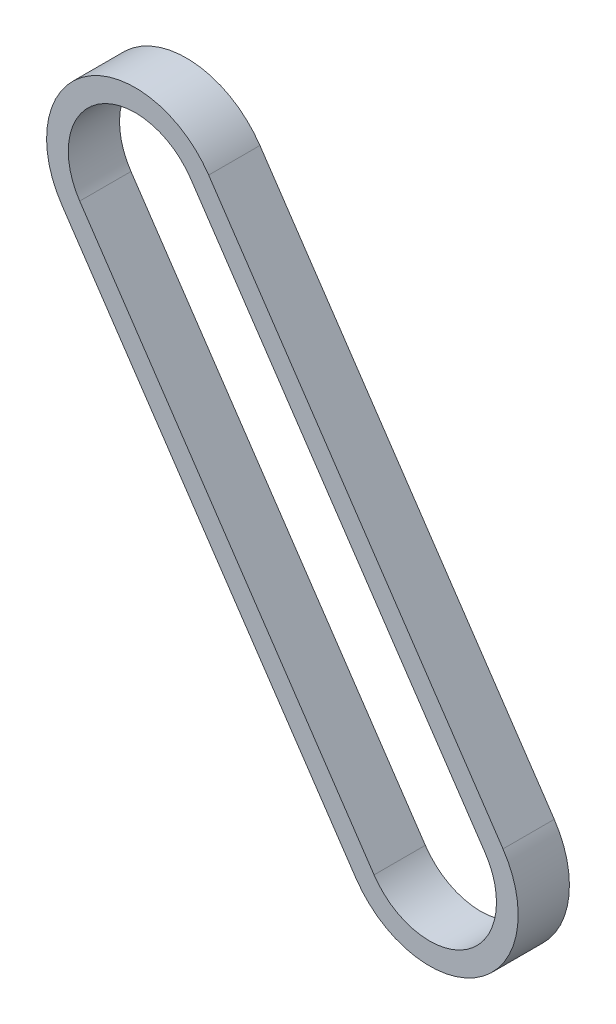
ISO-10303-21;
HEADER;
FILE_DESCRIPTION(('STEP AP214'),'2;1');
FILE_NAME('part.step','',(''),(''),'','','');
FILE_SCHEMA(('AUTOMOTIVE_DESIGN { 1 0 10303 214 1 1 1 1 }'));
ENDSEC;
DATA;
#1=APPLICATION_CONTEXT('core data for automotive mechanical design processes');
#2=APPLICATION_PROTOCOL_DEFINITION('international standard','automotive_design',2000,#1);
#3=PRODUCT_CONTEXT('',#1,'mechanical');
#4=PRODUCT('Part','Part','',(#3));
#5=PRODUCT_RELATED_PRODUCT_CATEGORY('part','',(#4));
#6=PRODUCT_DEFINITION_FORMATION('','',#4);
#7=PRODUCT_DEFINITION_CONTEXT('part definition',#1,'design');
#8=PRODUCT_DEFINITION('design','',#6,#7);
#9=PRODUCT_DEFINITION_SHAPE('','',#8);
#10=(LENGTH_UNIT() NAMED_UNIT(*) SI_UNIT(.MILLI.,.METRE.));
#11=(NAMED_UNIT(*) PLANE_ANGLE_UNIT() SI_UNIT($,.RADIAN.));
#12=(NAMED_UNIT(*) SI_UNIT($,.STERADIAN.) SOLID_ANGLE_UNIT());
#13=UNCERTAINTY_MEASURE_WITH_UNIT(LENGTH_MEASURE(1.E-05),#10,'distance_accuracy_value','');
#14=(GEOMETRIC_REPRESENTATION_CONTEXT(3) GLOBAL_UNCERTAINTY_ASSIGNED_CONTEXT((#13)) GLOBAL_UNIT_ASSIGNED_CONTEXT((#10,
#11,#12)) REPRESENTATION_CONTEXT('',''));
#15=CARTESIAN_POINT('',(0.,0.,0.));
#16=DIRECTION('',(0.,0.,1.));
#17=DIRECTION('',(1.,0.,0.));
#18=AXIS2_PLACEMENT_3D('',#15,#16,#17);
#19=CARTESIAN_POINT('',(0.,0.,4.5));
#20=DIRECTION('',(0.,0.,-1.));
#21=DIRECTION('',(-1.,0.,0.));
#22=AXIS2_PLACEMENT_3D('',#19,#20,#21);
#23=PLANE('',#22);
#24=CARTESIAN_POINT('',(0.,0.,4.5));
#25=DIRECTION('',(0.,0.,-1.));
#26=DIRECTION('',(-1.,0.,0.));
#27=AXIS2_PLACEMENT_3D('',#24,#25,#26);
#28=CIRCLE('',#27,15.5630935922472);
#29=CARTESIAN_POINT('',(-12.9023893331636,-8.70277149283569,4.5));
#30=VERTEX_POINT('',#29);
#31=CARTESIAN_POINT('',(12.9023893331636,8.70277149283567,4.5));
#32=VERTEX_POINT('',#31);
#33=EDGE_CURVE('E166',#30,#32,#28,.F.);
#34=ORIENTED_EDGE('',*,*,#33,.T.);
#35=DIRECTION('',(-0.559192903470746,0.829037572555042,0.));
#36=VECTOR('',#35,1.);
#37=CARTESIAN_POINT('',(12.9023893331636,8.70277149283569,4.5));
#38=LINE('',#37,#36);
#39=CARTESIAN_POINT('',(-38.7874445160736,85.3361016266235,4.5));
#40=VERTEX_POINT('',#39);
#41=EDGE_CURVE('E169',#32,#40,#38,.T.);
#42=ORIENTED_EDGE('',*,*,#41,.T.);
#43=CARTESIAN_POINT('',(-51.6898338492372,76.6333301337878,4.5));
#44=DIRECTION('',(0.,0.,-1.));
#45=DIRECTION('',(-1.,0.,0.));
#46=AXIS2_PLACEMENT_3D('',#43,#44,#45);
#47=CIRCLE('',#46,15.5630935922472);
#48=CARTESIAN_POINT('',(-64.5922231824008,67.9305586409521,4.5));
#49=VERTEX_POINT('',#48);
#50=EDGE_CURVE('E172',#40,#49,#47,.F.);
#51=ORIENTED_EDGE('',*,*,#50,.T.);
#52=DIRECTION('',(0.559192903470746,-0.829037572555042,0.));
#53=VECTOR('',#52,1.);
#54=CARTESIAN_POINT('',(-12.9023893331636,-8.70277149283569,4.5));
#55=LINE('',#54,#53);
#56=EDGE_CURVE('E174',#49,#30,#55,.T.);
#57=ORIENTED_EDGE('',*,*,#56,.T.);
#58=EDGE_LOOP('',(#34,#42,#51,#57));
#59=FACE_BOUND('',#58,.T.);
#60=CARTESIAN_POINT('',(0.,0.,4.5));
#61=DIRECTION('',(0.,0.,-1.));
#62=DIRECTION('',(-1.,0.,0.));
#63=AXIS2_PLACEMENT_3D('',#60,#61,#62);
#64=CIRCLE('',#63,11.7530935922472);
#65=CARTESIAN_POINT('',(-9.74375618172885,-6.57224653061215,4.5));
#66=VERTEX_POINT('',#65);
#67=CARTESIAN_POINT('',(9.74375618172887,6.57224653061213,4.5));
#68=VERTEX_POINT('',#67);
#69=EDGE_CURVE('E130',#66,#68,#64,.F.);
#70=ORIENTED_EDGE('',*,*,#69,.F.);
#71=DIRECTION('',(0.559192903470746,-0.829037572555042,0.));
#72=VECTOR('',#71,1.);
#73=CARTESIAN_POINT('',(-9.74375618172885,-6.57224653061214,4.5));
#74=LINE('',#73,#72);
#75=CARTESIAN_POINT('',(-61.433590030966,70.0610836031757,4.5));
#76=VERTEX_POINT('',#75);
#77=EDGE_CURVE('E152',#76,#66,#74,.T.);
#78=ORIENTED_EDGE('',*,*,#77,.F.);
#79=CARTESIAN_POINT('',(-51.6898338492372,76.6333301337878,4.5));
#80=DIRECTION('',(0.,0.,-1.));
#81=DIRECTION('',(-1.,0.,0.));
#82=AXIS2_PLACEMENT_3D('',#79,#80,#81);
#83=CIRCLE('',#82,11.7530935922472);
#84=CARTESIAN_POINT('',(-41.9460776675083,83.2055766644,4.5));
#85=VERTEX_POINT('',#84);
#86=EDGE_CURVE('E150',#85,#76,#83,.F.);
#87=ORIENTED_EDGE('',*,*,#86,.F.);
#88=DIRECTION('',(-0.559192903470746,0.829037572555042,0.));
#89=VECTOR('',#88,1.);
#90=CARTESIAN_POINT('',(9.74375618172886,6.57224653061215,4.5));
#91=LINE('',#90,#89);
#92=EDGE_CURVE('E138',#68,#85,#91,.T.);
#93=ORIENTED_EDGE('',*,*,#92,.F.);
#94=EDGE_LOOP('',(#70,#78,#87,#93));
#95=FACE_BOUND('',#94,.T.);
#96=ADVANCED_FACE('F65',(#59,#95),#23,.F.);
#97=CARTESIAN_POINT('',(0.,0.,-4.5));
#98=DIRECTION('',(0.,0.,-1.));
#99=DIRECTION('',(-1.,0.,0.));
#100=AXIS2_PLACEMENT_3D('',#97,#98,#99);
#101=PLANE('',#100);
#102=CARTESIAN_POINT('',(0.,0.,-4.5));
#103=DIRECTION('',(0.,0.,-1.));
#104=DIRECTION('',(-1.,0.,0.));
#105=AXIS2_PLACEMENT_3D('',#102,#103,#104);
#106=CIRCLE('',#105,15.5630935922472);
#107=CARTESIAN_POINT('',(-12.9023893331636,-8.70277149283569,-4.5));
#108=VERTEX_POINT('',#107);
#109=CARTESIAN_POINT('',(12.9023893331636,8.70277149283567,-4.5));
#110=VERTEX_POINT('',#109);
#111=EDGE_CURVE('E146',#108,#110,#106,.F.);
#112=ORIENTED_EDGE('',*,*,#111,.F.);
#113=DIRECTION('',(0.559192903470746,-0.829037572555042,0.));
#114=VECTOR('',#113,1.);
#115=CARTESIAN_POINT('',(-12.9023893331636,-8.70277149283569,-4.5));
#116=LINE('',#115,#114);
#117=CARTESIAN_POINT('',(-64.5922231824008,67.9305586409521,-4.5));
#118=VERTEX_POINT('',#117);
#119=EDGE_CURVE('E170',#118,#108,#116,.T.);
#120=ORIENTED_EDGE('',*,*,#119,.F.);
#121=CARTESIAN_POINT('',(-51.6898338492372,76.6333301337878,-4.5));
#122=DIRECTION('',(0.,0.,-1.));
#123=DIRECTION('',(-1.,0.,0.));
#124=AXIS2_PLACEMENT_3D('',#121,#122,#123);
#125=CIRCLE('',#124,15.5630935922472);
#126=CARTESIAN_POINT('',(-38.7874445160736,85.3361016266235,-4.5));
#127=VERTEX_POINT('',#126);
#128=EDGE_CURVE('E181',#127,#118,#125,.F.);
#129=ORIENTED_EDGE('',*,*,#128,.F.);
#130=DIRECTION('',(-0.559192903470746,0.829037572555042,0.));
#131=VECTOR('',#130,1.);
#132=CARTESIAN_POINT('',(12.9023893331636,8.70277149283569,-4.5));
#133=LINE('',#132,#131);
#134=EDGE_CURVE('E179',#110,#127,#133,.T.);
#135=ORIENTED_EDGE('',*,*,#134,.F.);
#136=EDGE_LOOP('',(#112,#120,#129,#135));
#137=FACE_BOUND('',#136,.T.);
#138=DIRECTION('',(0.559192903470746,-0.829037572555042,0.));
#139=VECTOR('',#138,1.);
#140=CARTESIAN_POINT('',(-9.74375618172885,-6.57224653061214,-4.5));
#141=LINE('',#140,#139);
#142=CARTESIAN_POINT('',(-61.4335900309661,70.0610836031757,-4.5));
#143=VERTEX_POINT('',#142);
#144=CARTESIAN_POINT('',(-9.74375618172885,-6.57224653061215,-4.5));
#145=VERTEX_POINT('',#144);
#146=EDGE_CURVE('E139',#143,#145,#141,.T.);
#147=ORIENTED_EDGE('',*,*,#146,.T.);
#148=CARTESIAN_POINT('',(0.,0.,-4.5));
#149=DIRECTION('',(0.,0.,-1.));
#150=DIRECTION('',(-1.,0.,0.));
#151=AXIS2_PLACEMENT_3D('',#148,#149,#150);
#152=CIRCLE('',#151,11.7530935922472);
#153=CARTESIAN_POINT('',(9.74375618172887,6.57224653061213,-4.5));
#154=VERTEX_POINT('',#153);
#155=EDGE_CURVE('E88',#145,#154,#152,.F.);
#156=ORIENTED_EDGE('',*,*,#155,.T.);
#157=DIRECTION('',(-0.559192903470746,0.829037572555042,0.));
#158=VECTOR('',#157,1.);
#159=CARTESIAN_POINT('',(9.74375618172886,6.57224653061215,-4.5));
#160=LINE('',#159,#158);
#161=CARTESIAN_POINT('',(-41.9460776675083,83.2055766644,-4.5));
#162=VERTEX_POINT('',#161);
#163=EDGE_CURVE('E145',#154,#162,#160,.T.);
#164=ORIENTED_EDGE('',*,*,#163,.T.);
#165=CARTESIAN_POINT('',(-51.6898338492372,76.6333301337878,-4.5));
#166=DIRECTION('',(0.,0.,-1.));
#167=DIRECTION('',(-1.,0.,0.));
#168=AXIS2_PLACEMENT_3D('',#165,#166,#167);
#169=CIRCLE('',#168,11.7530935922472);
#170=EDGE_CURVE('E158',#162,#143,#169,.F.);
#171=ORIENTED_EDGE('',*,*,#170,.T.);
#172=EDGE_LOOP('',(#147,#156,#164,#171));
#173=FACE_BOUND('',#172,.T.);
#174=ADVANCED_FACE('F199',(#137,#173),#101,.T.);
#175=CARTESIAN_POINT('',(0.,0.,4.5));
#176=DIRECTION('',(0.,0.,-1.));
#177=DIRECTION('',(-1.,0.,0.));
#178=AXIS2_PLACEMENT_3D('',#175,#176,#177);
#179=CYLINDRICAL_SURFACE('',#178,15.5630935922472);
#180=ORIENTED_EDGE('',*,*,#111,.T.);
#181=DIRECTION('',(0.,0.,-1.));
#182=VECTOR('',#181,1.);
#183=CARTESIAN_POINT('',(12.9023893331636,8.70277149283567,4.5));
#184=LINE('',#183,#182);
#185=EDGE_CURVE('E12',#32,#110,#184,.T.);
#186=ORIENTED_EDGE('',*,*,#185,.F.);
#187=ORIENTED_EDGE('',*,*,#33,.F.);
#188=DIRECTION('',(0.,0.,-1.));
#189=VECTOR('',#188,1.);
#190=CARTESIAN_POINT('',(-12.9023893331636,-8.70277149283569,4.5));
#191=LINE('',#190,#189);
#192=EDGE_CURVE('E176',#30,#108,#191,.T.);
#193=ORIENTED_EDGE('',*,*,#192,.T.);
#194=EDGE_LOOP('',(#180,#186,#187,#193));
#195=FACE_BOUND('',#194,.T.);
#196=ADVANCED_FACE('F67',(#195),#179,.T.);
#197=CARTESIAN_POINT('',(12.9023893331636,8.70277149283569,4.5));
#198=DIRECTION('',(-0.829037572555042,-0.559192903470746,0.));
#199=DIRECTION('',(0.559192903470746,-0.829037572555042,0.));
#200=AXIS2_PLACEMENT_3D('',#197,#198,#199);
#201=PLANE('',#200);
#202=ORIENTED_EDGE('',*,*,#134,.T.);
#203=DIRECTION('',(0.,0.,-1.));
#204=VECTOR('',#203,1.);
#205=CARTESIAN_POINT('',(-38.7874445160736,85.3361016266235,4.5));
#206=LINE('',#205,#204);
#207=EDGE_CURVE('E73',#40,#127,#206,.T.);
#208=ORIENTED_EDGE('',*,*,#207,.F.);
#209=ORIENTED_EDGE('',*,*,#41,.F.);
#210=ORIENTED_EDGE('',*,*,#185,.T.);
#211=EDGE_LOOP('',(#202,#208,#209,#210));
#212=FACE_BOUND('',#211,.T.);
#213=ADVANCED_FACE('F209',(#212),#201,.F.);
#214=CARTESIAN_POINT('',(-51.6898338492372,76.6333301337878,4.5));
#215=DIRECTION('',(0.,0.,-1.));
#216=DIRECTION('',(-1.,0.,0.));
#217=AXIS2_PLACEMENT_3D('',#214,#215,#216);
#218=CYLINDRICAL_SURFACE('',#217,15.5630935922472);
#219=ORIENTED_EDGE('',*,*,#128,.T.);
#220=DIRECTION('',(0.,0.,-1.));
#221=VECTOR('',#220,1.);
#222=CARTESIAN_POINT('',(-64.5922231824008,67.9305586409521,4.5));
#223=LINE('',#222,#221);
#224=EDGE_CURVE('E186',#49,#118,#223,.T.);
#225=ORIENTED_EDGE('',*,*,#224,.F.);
#226=ORIENTED_EDGE('',*,*,#50,.F.);
#227=ORIENTED_EDGE('',*,*,#207,.T.);
#228=EDGE_LOOP('',(#219,#225,#226,#227));
#229=FACE_BOUND('',#228,.T.);
#230=ADVANCED_FACE('F193',(#229),#218,.T.);
#231=CARTESIAN_POINT('',(-12.9023893331636,-8.70277149283569,4.5));
#232=DIRECTION('',(0.829037572555042,0.559192903470746,0.));
#233=DIRECTION('',(-0.559192903470746,0.829037572555042,0.));
#234=AXIS2_PLACEMENT_3D('',#231,#232,#233);
#235=PLANE('',#234);
#236=ORIENTED_EDGE('',*,*,#119,.T.);
#237=ORIENTED_EDGE('',*,*,#192,.F.);
#238=ORIENTED_EDGE('',*,*,#56,.F.);
#239=ORIENTED_EDGE('',*,*,#224,.T.);
#240=EDGE_LOOP('',(#236,#237,#238,#239));
#241=FACE_BOUND('',#240,.T.);
#242=ADVANCED_FACE('F203',(#241),#235,.F.);
#243=CARTESIAN_POINT('',(0.,0.,4.5));
#244=DIRECTION('',(0.,0.,-1.));
#245=DIRECTION('',(-1.,0.,0.));
#246=AXIS2_PLACEMENT_3D('',#243,#244,#245);
#247=CYLINDRICAL_SURFACE('',#246,11.7530935922472);
#248=ORIENTED_EDGE('',*,*,#155,.F.);
#249=DIRECTION('',(0.,0.,-1.));
#250=VECTOR('',#249,1.);
#251=CARTESIAN_POINT('',(-9.74375618172885,-6.57224653061215,4.5));
#252=LINE('',#251,#250);
#253=EDGE_CURVE('E134',#66,#145,#252,.T.);
#254=ORIENTED_EDGE('',*,*,#253,.F.);
#255=ORIENTED_EDGE('',*,*,#69,.T.);
#256=DIRECTION('',(0.,0.,-1.));
#257=VECTOR('',#256,1.);
#258=CARTESIAN_POINT('',(9.74375618172887,6.57224653061213,4.5));
#259=LINE('',#258,#257);
#260=EDGE_CURVE('E133',#68,#154,#259,.T.);
#261=ORIENTED_EDGE('',*,*,#260,.T.);
#262=EDGE_LOOP('',(#248,#254,#255,#261));
#263=FACE_BOUND('',#262,.T.);
#264=ADVANCED_FACE('F132',(#263),#247,.F.);
#265=CARTESIAN_POINT('',(9.74375618172886,6.57224653061215,4.5));
#266=DIRECTION('',(-0.829037572555042,-0.559192903470746,0.));
#267=DIRECTION('',(0.559192903470746,-0.829037572555042,0.));
#268=AXIS2_PLACEMENT_3D('',#265,#266,#267);
#269=PLANE('',#268);
#270=ORIENTED_EDGE('',*,*,#163,.F.);
#271=ORIENTED_EDGE('',*,*,#260,.F.);
#272=ORIENTED_EDGE('',*,*,#92,.T.);
#273=DIRECTION('',(0.,0.,-1.));
#274=VECTOR('',#273,1.);
#275=CARTESIAN_POINT('',(-41.9460776675083,83.2055766644,4.5));
#276=LINE('',#275,#274);
#277=EDGE_CURVE('E147',#85,#162,#276,.T.);
#278=ORIENTED_EDGE('',*,*,#277,.T.);
#279=EDGE_LOOP('',(#270,#271,#272,#278));
#280=FACE_BOUND('',#279,.T.);
#281=ADVANCED_FACE('F142',(#280),#269,.T.);
#282=CARTESIAN_POINT('',(-51.6898338492372,76.6333301337878,4.5));
#283=DIRECTION('',(0.,0.,-1.));
#284=DIRECTION('',(-1.,0.,0.));
#285=AXIS2_PLACEMENT_3D('',#282,#283,#284);
#286=CYLINDRICAL_SURFACE('',#285,11.7530935922472);
#287=ORIENTED_EDGE('',*,*,#170,.F.);
#288=ORIENTED_EDGE('',*,*,#277,.F.);
#289=ORIENTED_EDGE('',*,*,#86,.T.);
#290=DIRECTION('',(0.,0.,-1.));
#291=VECTOR('',#290,1.);
#292=CARTESIAN_POINT('',(-61.4335900309661,70.0610836031757,4.5));
#293=LINE('',#292,#291);
#294=EDGE_CURVE('E80',#76,#143,#293,.T.);
#295=ORIENTED_EDGE('',*,*,#294,.T.);
#296=EDGE_LOOP('',(#287,#288,#289,#295));
#297=FACE_BOUND('',#296,.T.);
#298=ADVANCED_FACE('F232',(#297),#286,.F.);
#299=CARTESIAN_POINT('',(-9.74375618172885,-6.57224653061214,4.5));
#300=DIRECTION('',(0.829037572555042,0.559192903470746,0.));
#301=DIRECTION('',(-0.559192903470746,0.829037572555042,0.));
#302=AXIS2_PLACEMENT_3D('',#299,#300,#301);
#303=PLANE('',#302);
#304=ORIENTED_EDGE('',*,*,#146,.F.);
#305=ORIENTED_EDGE('',*,*,#294,.F.);
#306=ORIENTED_EDGE('',*,*,#77,.T.);
#307=ORIENTED_EDGE('',*,*,#253,.T.);
#308=EDGE_LOOP('',(#304,#305,#306,#307));
#309=FACE_BOUND('',#308,.T.);
#310=ADVANCED_FACE('F236',(#309),#303,.T.);
#311=CLOSED_SHELL('',(#96,#174,#196,#213,#230,#242,#264,#281,#298,#310));
#312=MANIFOLD_SOLID_BREP('B2',#311);
#313=ADVANCED_BREP_SHAPE_REPRESENTATION('',(#18,#312),#14);
#314=SHAPE_DEFINITION_REPRESENTATION(#9,#313);
ENDSEC;
END-ISO-10303-21;
